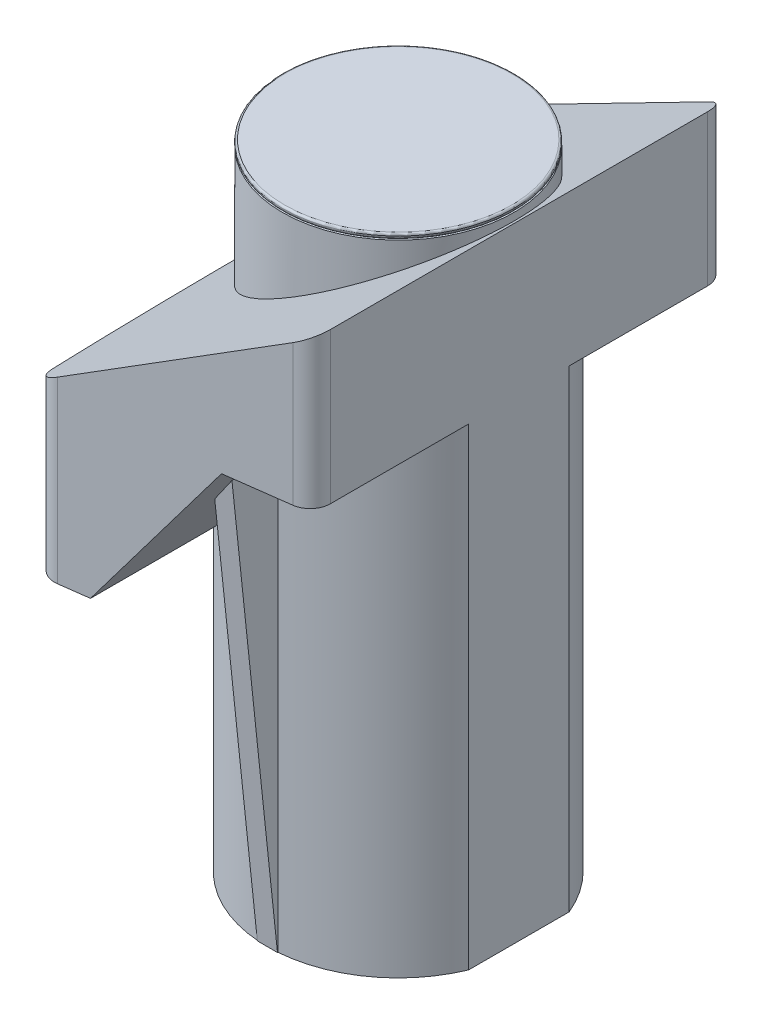
ISO-10303-21;
HEADER;
FILE_DESCRIPTION(('STEP AP214'),'2;1');
FILE_NAME('part.step','',(''),(''),'','','');
FILE_SCHEMA(('AUTOMOTIVE_DESIGN { 1 0 10303 214 1 1 1 1 }'));
ENDSEC;
DATA;
#1=APPLICATION_CONTEXT('core data for automotive mechanical design processes');
#2=APPLICATION_PROTOCOL_DEFINITION('international standard','automotive_design',2000,#1);
#3=PRODUCT_CONTEXT('',#1,'mechanical');
#4=PRODUCT('Part','Part','',(#3));
#5=PRODUCT_RELATED_PRODUCT_CATEGORY('part','',(#4));
#6=PRODUCT_DEFINITION_FORMATION('','',#4);
#7=PRODUCT_DEFINITION_CONTEXT('part definition',#1,'design');
#8=PRODUCT_DEFINITION('design','',#6,#7);
#9=PRODUCT_DEFINITION_SHAPE('','',#8);
#10=(LENGTH_UNIT() NAMED_UNIT(*) SI_UNIT(.MILLI.,.METRE.));
#11=(NAMED_UNIT(*) PLANE_ANGLE_UNIT() SI_UNIT($,.RADIAN.));
#12=(NAMED_UNIT(*) SI_UNIT($,.STERADIAN.) SOLID_ANGLE_UNIT());
#13=UNCERTAINTY_MEASURE_WITH_UNIT(LENGTH_MEASURE(1.E-05),#10,'distance_accuracy_value','');
#14=(GEOMETRIC_REPRESENTATION_CONTEXT(3) GLOBAL_UNCERTAINTY_ASSIGNED_CONTEXT((#13)) GLOBAL_UNIT_ASSIGNED_CONTEXT((#10,
#11,#12)) REPRESENTATION_CONTEXT('',''));
#15=CARTESIAN_POINT('',(0.,0.,0.));
#16=DIRECTION('',(0.,0.,1.));
#17=DIRECTION('',(1.,0.,0.));
#18=AXIS2_PLACEMENT_3D('',#15,#16,#17);
#19=CARTESIAN_POINT('',(0.,63.002,0.));
#20=DIRECTION('',(0.,-1.,0.));
#21=DIRECTION('',(0.,0.,-1.));
#22=AXIS2_PLACEMENT_3D('',#19,#20,#21);
#23=CYLINDRICAL_SURFACE('',#22,13.);
#24=CARTESIAN_POINT('',(0.,41.5313280471877,0.));
#25=DIRECTION('',(0.807133516819442,-0.590368940601281,0.));
#26=DIRECTION('',(-0.590368940601281,-0.807133516819442,0.));
#27=AXIS2_PLACEMENT_3D('',#24,#25,#26);
#28=ELLIPSE('',#27,22.0201286110338,13.);
#29=CARTESIAN_POINT('',(1.,42.8984960353907,12.9614813968157));
#30=VERTEX_POINT('',#29);
#31=CARTESIAN_POINT('',(3.99999999999999,47.,12.369316876853));
#32=VERTEX_POINT('',#31);
#33=EDGE_CURVE('E450',#30,#32,#28,.F.);
#34=ORIENTED_EDGE('',*,*,#33,.F.);
#35=DIRECTION('',(0.,-1.,0.));
#36=VECTOR('',#35,1.);
#37=CARTESIAN_POINT('',(1.,63.002,12.9614813968157));
#38=LINE('',#37,#36);
#39=CARTESIAN_POINT('',(1.,0.,12.9614813968157));
#40=VERTEX_POINT('',#39);
#41=EDGE_CURVE('E244',#30,#40,#38,.T.);
#42=ORIENTED_EDGE('',*,*,#41,.T.);
#43=CARTESIAN_POINT('',(0.,0.,0.));
#44=DIRECTION('',(0.,-1.,0.));
#45=DIRECTION('',(0.,0.,-1.));
#46=AXIS2_PLACEMENT_3D('',#43,#44,#45);
#47=CIRCLE('',#46,13.);
#48=CARTESIAN_POINT('',(12.,0.,5.00000000000002));
#49=VERTEX_POINT('',#48);
#50=EDGE_CURVE('E228',#49,#40,#47,.T.);
#51=ORIENTED_EDGE('',*,*,#50,.F.);
#52=DIRECTION('',(0.,-1.,0.));
#53=VECTOR('',#52,1.);
#54=CARTESIAN_POINT('',(12.,63.002,5.00000000000002));
#55=LINE('',#54,#53);
#56=CARTESIAN_POINT('',(12.,47.,5.00000000000002));
#57=VERTEX_POINT('',#56);
#58=EDGE_CURVE('E446',#57,#49,#55,.T.);
#59=ORIENTED_EDGE('',*,*,#58,.F.);
#60=CARTESIAN_POINT('',(0.,47.,0.));
#61=DIRECTION('',(0.,-1.,0.));
#62=DIRECTION('',(0.,0.,-1.));
#63=AXIS2_PLACEMENT_3D('',#60,#61,#62);
#64=CIRCLE('',#63,13.);
#65=EDGE_CURVE('E453',#32,#57,#64,.F.);
#66=ORIENTED_EDGE('',*,*,#65,.F.);
#67=EDGE_LOOP('',(#34,#42,#51,#59,#66));
#68=FACE_BOUND('',#67,.T.);
#69=ADVANCED_FACE('F36',(#68),#23,.T.);
#70=CARTESIAN_POINT('',(-7.50000000000001,31.2775681356645,-23.75));
#71=DIRECTION('',(0.807133516819442,-0.590368940601281,0.));
#72=DIRECTION('',(0.590368940601281,0.807133516819442,0.));
#73=AXIS2_PLACEMENT_3D('',#70,#71,#72);
#74=PLANE('',#73);
#75=DIRECTION('',(-0.588241093230889,-0.80422439201086,-0.0848265496722035));
#76=VECTOR('',#75,1.);
#77=CARTESIAN_POINT('',(-9.49838549757744,28.5454394552873,16.0108650793523));
#78=LINE('',#77,#76);
#79=CARTESIAN_POINT('',(1.,42.8984960353907,17.5247712466296));
#80=VERTEX_POINT('',#79);
#81=CARTESIAN_POINT('',(-1.,40.1641600589846,17.2363638210065));
#82=VERTEX_POINT('',#81);
#83=EDGE_CURVE('E55',#80,#82,#78,.T.);
#84=ORIENTED_EDGE('',*,*,#83,.F.);
#85=DIRECTION('',(0.,0.,-1.));
#86=VECTOR('',#85,1.);
#87=CARTESIAN_POINT('',(1.,42.8984960353907,-23.75));
#88=LINE('',#87,#86);
#89=EDGE_CURVE('E233',#80,#30,#88,.T.);
#90=ORIENTED_EDGE('',*,*,#89,.T.);
#91=ORIENTED_EDGE('',*,*,#33,.T.);
#92=DIRECTION('',(0.,0.,1.));
#93=VECTOR('',#92,1.);
#94=CARTESIAN_POINT('',(3.99999999999999,47.,-23.75));
#95=LINE('',#94,#93);
#96=CARTESIAN_POINT('',(3.99999999999999,47.,21.5612244897959));
#97=VERTEX_POINT('',#96);
#98=EDGE_CURVE('E514',#32,#97,#95,.T.);
#99=ORIENTED_EDGE('',*,*,#98,.T.);
#100=DIRECTION('',(0.588566823661349,0.804669720228169,-0.0780751908938524));
#101=VECTOR('',#100,1.);
#102=CARTESIAN_POINT('',(-5.34773648938603,34.2200739095535,22.8012303506328));
#103=LINE('',#102,#101);
#104=CARTESIAN_POINT('',(-7.50000000000001,31.2775681356645,23.0867346938775));
#105=VERTEX_POINT('',#104);
#106=EDGE_CURVE('E455',#105,#97,#103,.T.);
#107=ORIENTED_EDGE('',*,*,#106,.F.);
#108=DIRECTION('',(0.,0.,1.));
#109=VECTOR('',#108,1.);
#110=CARTESIAN_POINT('',(-7.50000000000001,31.2775681356645,-23.75));
#111=LINE('',#110,#109);
#112=CARTESIAN_POINT('',(-7.50000000000001,31.2775681356645,10.6183802907976));
#113=VERTEX_POINT('',#112);
#114=EDGE_CURVE('E521',#113,#105,#111,.T.);
#115=ORIENTED_EDGE('',*,*,#114,.F.);
#116=CARTESIAN_POINT('',(-1.,40.1641600589846,12.9614813968157));
#117=VERTEX_POINT('',#116);
#118=EDGE_CURVE('E425',#113,#117,#28,.F.);
#119=ORIENTED_EDGE('',*,*,#118,.T.);
#120=DIRECTION('',(0.,0.,-1.));
#121=VECTOR('',#120,1.);
#122=CARTESIAN_POINT('',(-1.,40.1641600589846,-23.75));
#123=LINE('',#122,#121);
#124=EDGE_CURVE('E60',#82,#117,#123,.T.);
#125=ORIENTED_EDGE('',*,*,#124,.F.);
#126=EDGE_LOOP('',(#84,#90,#91,#99,#107,#115,#119,#125));
#127=FACE_BOUND('',#126,.T.);
#128=ADVANCED_FACE('F353',(#127),#74,.T.);
#129=CARTESIAN_POINT('',(0.,41.5313280471877,0.));
#130=DIRECTION('',(0.807133516819442,-0.590368940601281,0.));
#131=DIRECTION('',(-0.590368940601281,-0.807133516819442,0.));
#132=AXIS2_PLACEMENT_3D('',#129,#130,#131);
#133=ELLIPSE('',#132,22.0201286110338,13.);
#134=CARTESIAN_POINT('',(3.99999999999999,47.,-12.369316876853));
#135=VERTEX_POINT('',#134);
#136=CARTESIAN_POINT('',(1.,42.8984960353907,-12.9614813968157));
#137=VERTEX_POINT('',#136);
#138=EDGE_CURVE('E438',#135,#137,#133,.F.);
#139=ORIENTED_EDGE('',*,*,#138,.T.);
#140=DIRECTION('',(0.,0.,-1.));
#141=VECTOR('',#140,1.);
#142=CARTESIAN_POINT('',(1.,42.8984960353907,-23.75));
#143=LINE('',#142,#141);
#144=CARTESIAN_POINT('',(1.,42.8984960353907,-17.5247712466296));
#145=VERTEX_POINT('',#144);
#146=EDGE_CURVE('E268',#137,#145,#143,.T.);
#147=ORIENTED_EDGE('',*,*,#146,.T.);
#148=DIRECTION('',(-0.588241093230889,-0.80422439201086,0.0848265496722035));
#149=VECTOR('',#148,1.);
#150=CARTESIAN_POINT('',(-7.12820853765382,31.7858695212714,-16.3526533969936));
#151=LINE('',#150,#149);
#152=CARTESIAN_POINT('',(-1.,40.1641600589846,-17.2363638210065));
#153=VERTEX_POINT('',#152);
#154=EDGE_CURVE('E270',#145,#153,#151,.T.);
#155=ORIENTED_EDGE('',*,*,#154,.T.);
#156=DIRECTION('',(0.,0.,-1.));
#157=VECTOR('',#156,1.);
#158=CARTESIAN_POINT('',(-1.,40.1641600589846,-23.75));
#159=LINE('',#158,#157);
#160=CARTESIAN_POINT('',(-1.,40.1641600589846,-12.9614813968157));
#161=VERTEX_POINT('',#160);
#162=EDGE_CURVE('E263',#161,#153,#159,.T.);
#163=ORIENTED_EDGE('',*,*,#162,.F.);
#164=CARTESIAN_POINT('',(-7.50000000000001,31.2775681356645,-10.6183802907976));
#165=VERTEX_POINT('',#164);
#166=EDGE_CURVE('E443',#161,#165,#133,.F.);
#167=ORIENTED_EDGE('',*,*,#166,.T.);
#168=CARTESIAN_POINT('',(-7.50000000000001,31.2775681356645,-23.0867346938775));
#169=VERTEX_POINT('',#168);
#170=EDGE_CURVE('E517',#169,#165,#111,.T.);
#171=ORIENTED_EDGE('',*,*,#170,.F.);
#172=DIRECTION('',(-0.588566823661349,-0.804669720228169,-0.0780751908938524));
#173=VECTOR('',#172,1.);
#174=CARTESIAN_POINT('',(-7.53047867716556,31.235898663921,-23.0907777837056));
#175=LINE('',#174,#173);
#176=CARTESIAN_POINT('',(3.99999999999999,47.,-21.5612244897959));
#177=VERTEX_POINT('',#176);
#178=EDGE_CURVE('E467',#177,#169,#175,.T.);
#179=ORIENTED_EDGE('',*,*,#178,.F.);
#180=EDGE_CURVE('E516',#177,#135,#95,.T.);
#181=ORIENTED_EDGE('',*,*,#180,.T.);
#182=EDGE_LOOP('',(#139,#147,#155,#163,#167,#171,#179,#181));
#183=FACE_BOUND('',#182,.T.);
#184=ADVANCED_FACE('F356',(#183),#74,.T.);
#185=CARTESIAN_POINT('',(1.,0.,-12.9614813968157));
#186=VERTEX_POINT('',#185);
#187=CARTESIAN_POINT('',(12.,0.,-5.00000000000002));
#188=VERTEX_POINT('',#187);
#189=EDGE_CURVE('E279',#186,#188,#47,.T.);
#190=ORIENTED_EDGE('',*,*,#189,.F.);
#191=DIRECTION('',(0.,-1.,0.));
#192=VECTOR('',#191,1.);
#193=CARTESIAN_POINT('',(1.,63.002,-12.9614813968157));
#194=LINE('',#193,#192);
#195=EDGE_CURVE('E266',#186,#137,#194,.F.);
#196=ORIENTED_EDGE('',*,*,#195,.T.);
#197=ORIENTED_EDGE('',*,*,#138,.F.);
#198=CARTESIAN_POINT('',(12.,47.,-5.00000000000002));
#199=VERTEX_POINT('',#198);
#200=EDGE_CURVE('E451',#199,#135,#64,.F.);
#201=ORIENTED_EDGE('',*,*,#200,.F.);
#202=DIRECTION('',(0.,-1.,0.));
#203=VECTOR('',#202,1.);
#204=CARTESIAN_POINT('',(12.,63.002,-5.00000000000002));
#205=LINE('',#204,#203);
#206=EDGE_CURVE('E501',#199,#188,#205,.T.);
#207=ORIENTED_EDGE('',*,*,#206,.T.);
#208=EDGE_LOOP('',(#190,#196,#197,#201,#207));
#209=FACE_BOUND('',#208,.T.);
#210=ADVANCED_FACE('F404',(#209),#23,.T.);
#211=CARTESIAN_POINT('',(-13.5,31.2775681356645,-23.75));
#212=DIRECTION('',(0.,-1.,0.));
#213=DIRECTION('',(1.,0.,0.));
#214=AXIS2_PLACEMENT_3D('',#211,#212,#213);
#215=PLANE('',#214);
#216=DIRECTION('',(1.,0.,0.));
#217=VECTOR('',#216,1.);
#218=CARTESIAN_POINT('',(-12.5009954668574,31.2775681356645,0.75));
#219=LINE('',#218,#217);
#220=CARTESIAN_POINT('',(-13.4990045331427,31.2775681356645,0.75));
#221=VERTEX_POINT('',#220);
#222=CARTESIAN_POINT('',(-12.9783473524174,31.2775681356645,0.75));
#223=VERTEX_POINT('',#222);
#224=EDGE_CURVE('E272',#221,#223,#219,.T.);
#225=ORIENTED_EDGE('',*,*,#224,.T.);
#226=CARTESIAN_POINT('',(0.,31.2775681356645,0.));
#227=DIRECTION('',(0.,-1.,0.));
#228=DIRECTION('',(1.,0.,0.));
#229=AXIS2_PLACEMENT_3D('',#226,#227,#228);
#230=CIRCLE('',#229,13.);
#231=EDGE_CURVE('E434',#223,#113,#230,.F.);
#232=ORIENTED_EDGE('',*,*,#231,.T.);
#233=ORIENTED_EDGE('',*,*,#114,.T.);
#234=DIRECTION('',(0.991316023943281,0.,-0.131501105216966));
#235=VECTOR('',#234,1.);
#236=CARTESIAN_POINT('',(-7.29064770285481,31.2775681356645,23.0589634707869));
#237=LINE('',#236,#235);
#238=CARTESIAN_POINT('',(-10.4126333388468,31.2775681356645,23.4731044225001));
#239=VERTEX_POINT('',#238);
#240=EDGE_CURVE('E441',#239,#105,#237,.T.);
#241=ORIENTED_EDGE('',*,*,#240,.F.);
#242=CARTESIAN_POINT('',(-10.6756355492807,31.2775681356645,21.4904723746135));
#243=DIRECTION('',(0.,-1.,0.));
#244=DIRECTION('',(1.,0.,0.));
#245=AXIS2_PLACEMENT_3D('',#242,#243,#244);
#246=CIRCLE('',#245,2.);
#247=CARTESIAN_POINT('',(-12.6697583826498,31.2775681356645,21.6436850550162));
#248=VERTEX_POINT('',#247);
#249=EDGE_CURVE('E11',#239,#248,#246,.T.);
#250=ORIENTED_EDGE('',*,*,#249,.T.);
#251=CARTESIAN_POINT('',(269.031250000059,31.2775681356642,0.));
#252=DIRECTION('',(0.,-1.,0.));
#253=DIRECTION('',(1.,0.,0.));
#254=AXIS2_PLACEMENT_3D('',#251,#252,#253);
#255=CIRCLE('',#254,282.531250000059);
#256=EDGE_CURVE('E474',#221,#248,#255,.F.);
#257=ORIENTED_EDGE('',*,*,#256,.F.);
#258=EDGE_LOOP('',(#225,#232,#233,#241,#250,#257));
#259=FACE_BOUND('',#258,.T.);
#260=ADVANCED_FACE('F360',(#259),#215,.T.);
#261=DIRECTION('',(0.,-1.,0.));
#262=VECTOR('',#261,1.);
#263=CARTESIAN_POINT('',(-1.,63.002,12.9614813968157));
#264=LINE('',#263,#262);
#265=CARTESIAN_POINT('',(-1.,0.,12.9614813968157));
#266=VERTEX_POINT('',#265);
#267=EDGE_CURVE('E240',#117,#266,#264,.T.);
#268=ORIENTED_EDGE('',*,*,#267,.F.);
#269=ORIENTED_EDGE('',*,*,#118,.F.);
#270=ORIENTED_EDGE('',*,*,#231,.F.);
#271=DIRECTION('',(0.,-1.,0.));
#272=VECTOR('',#271,1.);
#273=CARTESIAN_POINT('',(-12.9783473524174,63.002,0.75));
#274=LINE('',#273,#272);
#275=CARTESIAN_POINT('',(-12.9783473524174,0.,0.75));
#276=VERTEX_POINT('',#275);
#277=EDGE_CURVE('E288',#223,#276,#274,.T.);
#278=ORIENTED_EDGE('',*,*,#277,.T.);
#279=EDGE_CURVE('E426',#266,#276,#47,.T.);
#280=ORIENTED_EDGE('',*,*,#279,.F.);
#281=EDGE_LOOP('',(#268,#269,#270,#278,#280));
#282=FACE_BOUND('',#281,.T.);
#283=ADVANCED_FACE('F326',(#282),#23,.T.);
#284=CARTESIAN_POINT('',(3.99999999999999,47.,-23.75));
#285=DIRECTION('',(0.,-1.,0.));
#286=DIRECTION('',(0.,0.,-1.));
#287=AXIS2_PLACEMENT_3D('',#284,#285,#286);
#288=PLANE('',#287);
#289=DIRECTION('',(-0.991316023943281,0.,-0.131501105216966));
#290=VECTOR('',#289,1.);
#291=CARTESIAN_POINT('',(3.71467307889081,47.,-21.5990739793308));
#292=LINE('',#291,#290);
#293=CARTESIAN_POINT('',(10.2630022104339,47.,-20.7304180741261));
#294=VERTEX_POINT('',#293);
#295=EDGE_CURVE('E469',#294,#177,#292,.T.);
#296=ORIENTED_EDGE('',*,*,#295,.F.);
#297=CARTESIAN_POINT('',(9.99999999999999,47.,-18.7477860262395));
#298=DIRECTION('',(0.,-1.,0.));
#299=DIRECTION('',(0.,0.,-1.));
#300=AXIS2_PLACEMENT_3D('',#297,#298,#299);
#301=CIRCLE('',#300,2.);
#302=CARTESIAN_POINT('',(12.,47.,-18.7477860262395));
#303=VERTEX_POINT('',#302);
#304=EDGE_CURVE('E567',#294,#303,#301,.T.);
#305=ORIENTED_EDGE('',*,*,#304,.T.);
#306=DIRECTION('',(0.,0.,1.));
#307=VECTOR('',#306,1.);
#308=CARTESIAN_POINT('',(12.,47.,-23.75));
#309=LINE('',#308,#307);
#310=EDGE_CURVE('E524',#303,#199,#309,.T.);
#311=ORIENTED_EDGE('',*,*,#310,.T.);
#312=ORIENTED_EDGE('',*,*,#200,.T.);
#313=ORIENTED_EDGE('',*,*,#180,.F.);
#314=EDGE_LOOP('',(#296,#305,#311,#312,#313));
#315=FACE_BOUND('',#314,.T.);
#316=ADVANCED_FACE('F352',(#315),#288,.T.);
#317=CARTESIAN_POINT('',(0.,63.,0.));
#318=DIRECTION('',(0.,-1.,0.));
#319=DIRECTION('',(0.,0.,-1.));
#320=AXIS2_PLACEMENT_3D('',#317,#318,#319);
#321=CYLINDRICAL_SURFACE('',#320,11.5);
#322=CARTESIAN_POINT('',(0.,55.0717967697245,0.));
#323=DIRECTION('',(-0.500000000000001,0.866025403784438,0.));
#324=DIRECTION('',(-0.866025403784438,-0.500000000000001,0.));
#325=AXIS2_PLACEMENT_3D('',#322,#323,#324);
#326=ELLIPSE('',#325,13.2790561913614,11.5);
#327=CARTESIAN_POINT('',(-11.5,48.4322686740438,0.));
#328=VERTEX_POINT('',#327);
#329=EDGE_CURVE('E530',#328,#328,#326,.T.);
#330=ORIENTED_EDGE('',*,*,#329,.T.);
#331=EDGE_LOOP('',(#330));
#332=FACE_BOUND('',#331,.T.);
#333=CARTESIAN_POINT('',(0.,62.45,0.));
#334=DIRECTION('',(0.,1.,0.));
#335=DIRECTION('',(0.,0.,1.));
#336=AXIS2_PLACEMENT_3D('',#333,#334,#335);
#337=CIRCLE('',#336,11.5);
#338=CARTESIAN_POINT('',(0.,62.45,11.5));
#339=VERTEX_POINT('',#338);
#340=EDGE_CURVE('E533',#339,#339,#337,.T.);
#341=ORIENTED_EDGE('',*,*,#340,.F.);
#342=EDGE_LOOP('',(#341));
#343=FACE_BOUND('',#342,.T.);
#344=ADVANCED_FACE('F380',(#332,#343),#321,.T.);
#345=CARTESIAN_POINT('',(0.,62.7,0.));
#346=DIRECTION('',(0.,-1.,0.));
#347=DIRECTION('',(0.,0.,-1.));
#348=AXIS2_PLACEMENT_3D('',#345,#346,#347);
#349=CIRCLE('',#348,11.5);
#350=CARTESIAN_POINT('',(0.,62.7,-11.5));
#351=VERTEX_POINT('',#350);
#352=EDGE_CURVE('E542',#351,#351,#349,.F.);
#353=ORIENTED_EDGE('',*,*,#352,.T.);
#354=EDGE_LOOP('',(#353));
#355=FACE_BOUND('',#354,.T.);
#356=CARTESIAN_POINT('',(0.,62.8,0.));
#357=DIRECTION('',(0.,1.,0.));
#358=DIRECTION('',(0.,0.,1.));
#359=AXIS2_PLACEMENT_3D('',#356,#357,#358);
#360=CIRCLE('',#359,11.5);
#361=CARTESIAN_POINT('',(0.,62.8,11.5));
#362=VERTEX_POINT('',#361);
#363=EDGE_CURVE('E539',#362,#362,#360,.F.);
#364=ORIENTED_EDGE('',*,*,#363,.T.);
#365=EDGE_LOOP('',(#364));
#366=FACE_BOUND('',#365,.T.);
#367=ADVANCED_FACE('F373',(#355,#366),#321,.T.);
#368=CARTESIAN_POINT('',(0.,63.,0.));
#369=DIRECTION('',(0.,1.,0.));
#370=DIRECTION('',(0.,0.,1.));
#371=AXIS2_PLACEMENT_3D('',#368,#369,#370);
#372=PLANE('',#371);
#373=CARTESIAN_POINT('',(0.,63.,0.));
#374=DIRECTION('',(0.,1.,0.));
#375=DIRECTION('',(0.,0.,1.));
#376=AXIS2_PLACEMENT_3D('',#373,#374,#375);
#377=CIRCLE('',#376,11.3);
#378=CARTESIAN_POINT('',(0.,63.,11.3));
#379=VERTEX_POINT('',#378);
#380=EDGE_CURVE('E536',#379,#379,#377,.T.);
#381=ORIENTED_EDGE('',*,*,#380,.T.);
#382=EDGE_LOOP('',(#381));
#383=FACE_BOUND('',#382,.T.);
#384=ADVANCED_FACE('F365',(#383),#372,.T.);
#385=CARTESIAN_POINT('',(-11.7,62.45,0.));
#386=DIRECTION('',(0.,1.,0.));
#387=DIRECTION('',(0.,0.,1.));
#388=AXIS2_PLACEMENT_3D('',#385,#386,#387);
#389=PLANE('',#388);
#390=CARTESIAN_POINT('',(0.,62.45,0.));
#391=DIRECTION('',(0.,-1.,0.));
#392=DIRECTION('',(0.,0.,-1.));
#393=AXIS2_PLACEMENT_3D('',#390,#391,#392);
#394=CIRCLE('',#393,11.3);
#395=CARTESIAN_POINT('',(0.,62.45,-11.3));
#396=VERTEX_POINT('',#395);
#397=EDGE_CURVE('E526',#396,#396,#394,.T.);
#398=ORIENTED_EDGE('',*,*,#397,.T.);
#399=EDGE_LOOP('',(#398));
#400=FACE_BOUND('',#399,.T.);
#401=ORIENTED_EDGE('',*,*,#340,.T.);
#402=EDGE_LOOP('',(#401));
#403=FACE_BOUND('',#402,.T.);
#404=ADVANCED_FACE('F361',(#400,#403),#389,.T.);
#405=CARTESIAN_POINT('',(0.,-22.4131814697477,0.));
#406=DIRECTION('',(0.,-1.,0.));
#407=DIRECTION('',(0.,0.,-1.));
#408=AXIS2_PLACEMENT_3D('',#405,#406,#407);
#409=CYLINDRICAL_SURFACE('',#408,11.3);
#410=CARTESIAN_POINT('',(0.,62.5,0.));
#411=DIRECTION('',(0.,-1.,0.));
#412=DIRECTION('',(0.,0.,-1.));
#413=AXIS2_PLACEMENT_3D('',#410,#411,#412);
#414=CIRCLE('',#413,11.3);
#415=CARTESIAN_POINT('',(0.,62.5,-11.3));
#416=VERTEX_POINT('',#415);
#417=EDGE_CURVE('E529',#416,#416,#414,.T.);
#418=ORIENTED_EDGE('',*,*,#417,.T.);
#419=EDGE_LOOP('',(#418));
#420=FACE_BOUND('',#419,.T.);
#421=ORIENTED_EDGE('',*,*,#397,.F.);
#422=EDGE_LOOP('',(#421));
#423=FACE_BOUND('',#422,.T.);
#424=ADVANCED_FACE('F364',(#420,#423),#409,.T.);
#425=CARTESIAN_POINT('',(0.,62.8,0.));
#426=DIRECTION('',(0.,1.,0.));
#427=DIRECTION('',(0.,0.,1.));
#428=AXIS2_PLACEMENT_3D('',#425,#426,#427);
#429=TOROIDAL_SURFACE('',#428,11.3,0.2);
#430=ORIENTED_EDGE('',*,*,#363,.F.);
#431=EDGE_LOOP('',(#430));
#432=FACE_BOUND('',#431,.T.);
#433=ORIENTED_EDGE('',*,*,#380,.F.);
#434=EDGE_LOOP('',(#433));
#435=FACE_BOUND('',#434,.T.);
#436=ADVANCED_FACE('F369',(#432,#435),#429,.T.);
#437=CARTESIAN_POINT('',(0.,62.7,0.));
#438=DIRECTION('',(0.,-1.,0.));
#439=DIRECTION('',(0.,0.,-1.));
#440=AXIS2_PLACEMENT_3D('',#437,#438,#439);
#441=TOROIDAL_SURFACE('',#440,11.3,0.2);
#442=ORIENTED_EDGE('',*,*,#352,.F.);
#443=EDGE_LOOP('',(#442));
#444=FACE_BOUND('',#443,.T.);
#445=ORIENTED_EDGE('',*,*,#417,.F.);
#446=EDGE_LOOP('',(#445));
#447=FACE_BOUND('',#446,.T.);
#448=ADVANCED_FACE('F343',(#444,#447),#441,.T.);
#449=CARTESIAN_POINT('',(-13.5,47.2775681356645,-23.75));
#450=DIRECTION('',(-0.500000000000001,0.866025403784438,0.));
#451=DIRECTION('',(-0.866025403784438,-0.500000000000001,0.));
#452=AXIS2_PLACEMENT_3D('',#449,#450,#451);
#453=PLANE('',#452);
#454=CARTESIAN_POINT('',(9.99999999999999,60.8452994616208,18.7477860262395));
#455=DIRECTION('',(-0.500000000000001,0.866025403784438,0.));
#456=DIRECTION('',(-0.866025403784438,-0.500000000000001,0.));
#457=AXIS2_PLACEMENT_3D('',#454,#455,#456);
#458=ELLIPSE('',#457,2.3094010767585,2.);
#459=CARTESIAN_POINT('',(10.2630022104339,60.9971438586122,20.7304180741261));
#460=VERTEX_POINT('',#459);
#461=CARTESIAN_POINT('',(12.,62.,18.7477860262395));
#462=VERTEX_POINT('',#461);
#463=EDGE_CURVE('E557',#460,#462,#458,.T.);
#464=ORIENTED_EDGE('',*,*,#463,.T.);
#465=DIRECTION('',(0.,0.,1.));
#466=VECTOR('',#465,1.);
#467=CARTESIAN_POINT('',(12.,62.,-23.75));
#468=LINE('',#467,#466);
#469=CARTESIAN_POINT('',(12.,62.,-18.7477860262395));
#470=VERTEX_POINT('',#469);
#471=EDGE_CURVE('E548',#470,#462,#468,.T.);
#472=ORIENTED_EDGE('',*,*,#471,.F.);
#473=CARTESIAN_POINT('',(9.99999999999999,60.8452994616207,-18.7477860262395));
#474=DIRECTION('',(-0.500000000000001,0.866025403784438,0.));
#475=DIRECTION('',(-0.866025403784438,-0.500000000000001,0.));
#476=AXIS2_PLACEMENT_3D('',#473,#474,#475);
#477=ELLIPSE('',#476,2.3094010767585,2.);
#478=CARTESIAN_POINT('',(10.2630022104339,60.9971438586122,-20.7304180741261));
#479=VERTEX_POINT('',#478);
#480=EDGE_CURVE('E560',#470,#479,#477,.T.);
#481=ORIENTED_EDGE('',*,*,#480,.T.);
#482=DIRECTION('',(0.860366614832539,0.496732896675335,0.114130265232888));
#483=VECTOR('',#482,1.);
#484=CARTESIAN_POINT('',(-13.4869742825579,47.2850885371361,-23.8809251599311));
#485=LINE('',#484,#483);
#486=CARTESIAN_POINT('',(-10.4126333388468,49.0600601085684,-23.4731044225001));
#487=VERTEX_POINT('',#486);
#488=EDGE_CURVE('E471',#487,#479,#485,.T.);
#489=ORIENTED_EDGE('',*,*,#488,.F.);
#490=CARTESIAN_POINT('',(-10.6756355492807,48.9082157115769,-21.4904723746135));
#491=DIRECTION('',(-0.500000000000001,0.866025403784438,0.));
#492=DIRECTION('',(0.866025403784438,0.500000000000001,0.));
#493=AXIS2_PLACEMENT_3D('',#490,#491,#492);
#494=ELLIPSE('',#493,2.3094010767585,2.);
#495=CARTESIAN_POINT('',(-12.6697583826498,47.7569083569341,-21.6436850550163));
#496=VERTEX_POINT('',#495);
#497=EDGE_CURVE('E553',#487,#496,#494,.T.);
#498=ORIENTED_EDGE('',*,*,#497,.T.);
#499=CARTESIAN_POINT('',(269.031250000059,210.397061377681,0.));
#500=DIRECTION('',(-0.500000000000001,0.866025403784438,0.));
#501=DIRECTION('',(0.866025403784438,0.500000000000001,0.));
#502=AXIS2_PLACEMENT_3D('',#499,#500,#501);
#503=ELLIPSE('',#502,326.238986484031,282.531250000059);
#504=CARTESIAN_POINT('',(-12.6697583826498,47.7569083569341,21.6436850550162));
#505=VERTEX_POINT('',#504);
#506=EDGE_CURVE('E477',#505,#496,#503,.F.);
#507=ORIENTED_EDGE('',*,*,#506,.F.);
#508=CARTESIAN_POINT('',(-10.6756355492807,48.9082157115769,21.4904723746135));
#509=DIRECTION('',(-0.500000000000001,0.866025403784438,0.));
#510=DIRECTION('',(0.866025403784438,0.500000000000001,0.));
#511=AXIS2_PLACEMENT_3D('',#508,#509,#510);
#512=ELLIPSE('',#511,2.3094010767585,2.);
#513=CARTESIAN_POINT('',(-10.4126333388468,49.0600601085684,23.4731044225001));
#514=VERTEX_POINT('',#513);
#515=EDGE_CURVE('E555',#505,#514,#512,.T.);
#516=ORIENTED_EDGE('',*,*,#515,.T.);
#517=DIRECTION('',(-0.860366614832539,-0.496732896675335,0.114130265232888));
#518=VECTOR('',#517,1.);
#519=CARTESIAN_POINT('',(-8.82276546001081,49.9779707563903,23.26220358143));
#520=LINE('',#519,#518);
#521=EDGE_CURVE('E461',#460,#514,#520,.T.);
#522=ORIENTED_EDGE('',*,*,#521,.F.);
#523=EDGE_LOOP('',(#464,#472,#481,#489,#498,#507,#516,#522));
#524=FACE_BOUND('',#523,.T.);
#525=ORIENTED_EDGE('',*,*,#329,.F.);
#526=EDGE_LOOP('',(#525));
#527=FACE_BOUND('',#526,.T.);
#528=ADVANCED_FACE('F339',(#524,#527),#453,.T.);
#529=CARTESIAN_POINT('',(12.,47.,-23.75));
#530=DIRECTION('',(1.,0.,0.));
#531=DIRECTION('',(0.,0.,-1.));
#532=AXIS2_PLACEMENT_3D('',#529,#530,#531);
#533=PLANE('',#532);
#534=ORIENTED_EDGE('',*,*,#471,.T.);
#535=DIRECTION('',(0.,1.,0.));
#536=VECTOR('',#535,1.);
#537=CARTESIAN_POINT('',(12.,47.,18.7477860262395));
#538=LINE('',#537,#536);
#539=CARTESIAN_POINT('',(12.,47.,18.7477860262395));
#540=VERTEX_POINT('',#539);
#541=EDGE_CURVE('E545',#462,#540,#538,.F.);
#542=ORIENTED_EDGE('',*,*,#541,.T.);
#543=EDGE_CURVE('E509',#57,#540,#309,.T.);
#544=ORIENTED_EDGE('',*,*,#543,.F.);
#545=ORIENTED_EDGE('',*,*,#58,.T.);
#546=DIRECTION('',(0.,0.,1.));
#547=VECTOR('',#546,1.);
#548=CARTESIAN_POINT('',(12.,0.,5.00000000000002));
#549=LINE('',#548,#547);
#550=EDGE_CURVE('E500',#188,#49,#549,.T.);
#551=ORIENTED_EDGE('',*,*,#550,.F.);
#552=ORIENTED_EDGE('',*,*,#206,.F.);
#553=ORIENTED_EDGE('',*,*,#310,.F.);
#554=DIRECTION('',(0.,1.,0.));
#555=VECTOR('',#554,1.);
#556=CARTESIAN_POINT('',(12.,62.,-18.7477860262395));
#557=LINE('',#556,#555);
#558=EDGE_CURVE('E550',#303,#470,#557,.T.);
#559=ORIENTED_EDGE('',*,*,#558,.T.);
#560=EDGE_LOOP('',(#534,#542,#544,#545,#551,#552,#553,#559));
#561=FACE_BOUND('',#560,.T.);
#562=ADVANCED_FACE('F342',(#561),#533,.T.);
#563=ORIENTED_EDGE('',*,*,#543,.T.);
#564=CARTESIAN_POINT('',(9.99999999999999,47.,18.7477860262395));
#565=DIRECTION('',(0.,-1.,0.));
#566=DIRECTION('',(0.,0.,-1.));
#567=AXIS2_PLACEMENT_3D('',#564,#565,#566);
#568=CIRCLE('',#567,2.);
#569=CARTESIAN_POINT('',(10.2630022104339,47.,20.7304180741261));
#570=VERTEX_POINT('',#569);
#571=EDGE_CURVE('E574',#540,#570,#568,.T.);
#572=ORIENTED_EDGE('',*,*,#571,.T.);
#573=DIRECTION('',(0.991316023943281,0.,-0.131501105216966));
#574=VECTOR('',#573,1.);
#575=CARTESIAN_POINT('',(9.90673283536272,47.,20.7776782973498));
#576=LINE('',#575,#574);
#577=EDGE_CURVE('E458',#97,#570,#576,.T.);
#578=ORIENTED_EDGE('',*,*,#577,.F.);
#579=ORIENTED_EDGE('',*,*,#98,.F.);
#580=ORIENTED_EDGE('',*,*,#65,.T.);
#581=EDGE_LOOP('',(#563,#572,#578,#579,#580));
#582=FACE_BOUND('',#581,.T.);
#583=ADVANCED_FACE('F347',(#582),#288,.T.);
#584=DIRECTION('',(-1.,0.,0.));
#585=VECTOR('',#584,1.);
#586=CARTESIAN_POINT('',(-12.5009954668574,31.2775681356645,-0.75));
#587=LINE('',#586,#585);
#588=CARTESIAN_POINT('',(-12.9783473524174,31.2775681356645,-0.75));
#589=VERTEX_POINT('',#588);
#590=CARTESIAN_POINT('',(-13.4990045331427,31.2775681356645,-0.75));
#591=VERTEX_POINT('',#590);
#592=EDGE_CURVE('E287',#589,#591,#587,.T.);
#593=ORIENTED_EDGE('',*,*,#592,.T.);
#594=CARTESIAN_POINT('',(-12.6697583826498,31.2775681356645,-21.6436850550162));
#595=VERTEX_POINT('',#594);
#596=EDGE_CURVE('E482',#595,#591,#255,.F.);
#597=ORIENTED_EDGE('',*,*,#596,.F.);
#598=CARTESIAN_POINT('',(-10.6756355492807,31.2775681356645,-21.4904723746135));
#599=DIRECTION('',(0.,-1.,0.));
#600=DIRECTION('',(1.,0.,0.));
#601=AXIS2_PLACEMENT_3D('',#598,#599,#600);
#602=CIRCLE('',#601,2.);
#603=CARTESIAN_POINT('',(-10.4126333388468,31.2775681356645,-23.4731044225001));
#604=VERTEX_POINT('',#603);
#605=EDGE_CURVE('E47',#595,#604,#602,.T.);
#606=ORIENTED_EDGE('',*,*,#605,.T.);
#607=DIRECTION('',(-0.991316023943281,0.,-0.131501105216966));
#608=VECTOR('',#607,1.);
#609=CARTESIAN_POINT('',(-13.4827074593267,31.2775681356645,-23.8803591527678));
#610=LINE('',#609,#608);
#611=EDGE_CURVE('E464',#169,#604,#610,.T.);
#612=ORIENTED_EDGE('',*,*,#611,.F.);
#613=ORIENTED_EDGE('',*,*,#170,.T.);
#614=EDGE_CURVE('E437',#165,#589,#230,.F.);
#615=ORIENTED_EDGE('',*,*,#614,.T.);
#616=EDGE_LOOP('',(#593,#597,#606,#612,#613,#615));
#617=FACE_BOUND('',#616,.T.);
#618=ADVANCED_FACE('F337',(#617),#215,.T.);
#619=CARTESIAN_POINT('',(269.031250000059,15.5,0.));
#620=DIRECTION('',(0.,1.,0.));
#621=DIRECTION('',(0.,0.,1.));
#622=AXIS2_PLACEMENT_3D('',#619,#620,#621);
#623=CYLINDRICAL_SURFACE('',#622,282.531250000059);
#624=ORIENTED_EDGE('',*,*,#596,.T.);
#625=CARTESIAN_POINT('',(269.031250000059,31.2775681356645,0.));
#626=DIRECTION('',(0.,1.,0.));
#627=DIRECTION('',(-0.99999647661327,0.,-0.00265457360907025));
#628=AXIS2_PLACEMENT_3D('',#625,#626,#627);
#629=CIRCLE('',#628,282.531250000059);
#630=EDGE_CURVE('E286',#591,#221,#629,.T.);
#631=ORIENTED_EDGE('',*,*,#630,.T.);
#632=ORIENTED_EDGE('',*,*,#256,.T.);
#633=DIRECTION('',(0.,1.,0.));
#634=VECTOR('',#633,1.);
#635=CARTESIAN_POINT('',(-12.6697583826498,15.5,21.6436850550162));
#636=LINE('',#635,#634);
#637=EDGE_CURVE('E578',#248,#505,#636,.T.);
#638=ORIENTED_EDGE('',*,*,#637,.T.);
#639=ORIENTED_EDGE('',*,*,#506,.T.);
#640=DIRECTION('',(0.,1.,0.));
#641=VECTOR('',#640,1.);
#642=CARTESIAN_POINT('',(-12.6697583826498,15.5,-21.6436850550162));
#643=LINE('',#642,#641);
#644=EDGE_CURVE('E576',#496,#595,#643,.F.);
#645=ORIENTED_EDGE('',*,*,#644,.T.);
#646=EDGE_LOOP('',(#624,#631,#632,#638,#639,#645));
#647=FACE_BOUND('',#646,.T.);
#648=ADVANCED_FACE('F332',(#647),#623,.T.);
#649=CARTESIAN_POINT('',(-12.5,-437.,23.75));
#650=DIRECTION('',(-0.131501105216966,0.,-0.991316023943281));
#651=DIRECTION('',(-0.991316023943281,0.,0.131501105216966));
#652=AXIS2_PLACEMENT_3D('',#649,#650,#651);
#653=PLANE('',#652);
#654=ORIENTED_EDGE('',*,*,#577,.T.);
#655=DIRECTION('',(0.,1.,0.));
#656=VECTOR('',#655,1.);
#657=CARTESIAN_POINT('',(10.2630022104339,62.,20.7304180741261));
#658=LINE('',#657,#656);
#659=EDGE_CURVE('E571',#570,#460,#658,.T.);
#660=ORIENTED_EDGE('',*,*,#659,.T.);
#661=ORIENTED_EDGE('',*,*,#521,.T.);
#662=DIRECTION('',(0.,1.,0.));
#663=VECTOR('',#662,1.);
#664=CARTESIAN_POINT('',(-10.4126333388468,-437.,23.4731044225001));
#665=LINE('',#664,#663);
#666=EDGE_CURVE('E569',#514,#239,#665,.F.);
#667=ORIENTED_EDGE('',*,*,#666,.T.);
#668=ORIENTED_EDGE('',*,*,#240,.T.);
#669=ORIENTED_EDGE('',*,*,#106,.T.);
#670=EDGE_LOOP('',(#654,#660,#661,#667,#668,#669));
#671=FACE_BOUND('',#670,.T.);
#672=ADVANCED_FACE('F329',(#671),#653,.F.);
#673=CARTESIAN_POINT('',(-12.5,-437.,-23.75));
#674=DIRECTION('',(-0.131501105216966,0.,0.991316023943281));
#675=DIRECTION('',(0.991316023943281,0.,0.131501105216966));
#676=AXIS2_PLACEMENT_3D('',#673,#674,#675);
#677=PLANE('',#676);
#678=ORIENTED_EDGE('',*,*,#488,.T.);
#679=DIRECTION('',(0.,1.,0.));
#680=VECTOR('',#679,1.);
#681=CARTESIAN_POINT('',(10.2630022104339,47.,-20.7304180741261));
#682=LINE('',#681,#680);
#683=EDGE_CURVE('E565',#479,#294,#682,.F.);
#684=ORIENTED_EDGE('',*,*,#683,.T.);
#685=ORIENTED_EDGE('',*,*,#295,.T.);
#686=ORIENTED_EDGE('',*,*,#178,.T.);
#687=ORIENTED_EDGE('',*,*,#611,.T.);
#688=DIRECTION('',(0.,1.,0.));
#689=VECTOR('',#688,1.);
#690=CARTESIAN_POINT('',(-10.4126333388468,-437.,-23.4731044225001));
#691=LINE('',#690,#689);
#692=EDGE_CURVE('E562',#604,#487,#691,.T.);
#693=ORIENTED_EDGE('',*,*,#692,.T.);
#694=EDGE_LOOP('',(#678,#684,#685,#686,#687,#693));
#695=FACE_BOUND('',#694,.T.);
#696=ADVANCED_FACE('F324',(#695),#677,.F.);
#697=DIRECTION('',(0.,-1.,0.));
#698=VECTOR('',#697,1.);
#699=CARTESIAN_POINT('',(-1.,63.002,-12.9614813968157));
#700=LINE('',#699,#698);
#701=CARTESIAN_POINT('',(-1.,0.,-12.9614813968157));
#702=VERTEX_POINT('',#701);
#703=EDGE_CURVE('E260',#702,#161,#700,.F.);
#704=ORIENTED_EDGE('',*,*,#703,.F.);
#705=CARTESIAN_POINT('',(-12.9783473524174,0.,-0.75));
#706=VERTEX_POINT('',#705);
#707=EDGE_CURVE('E431',#706,#702,#47,.T.);
#708=ORIENTED_EDGE('',*,*,#707,.F.);
#709=DIRECTION('',(0.,-1.,0.));
#710=VECTOR('',#709,1.);
#711=CARTESIAN_POINT('',(-12.9783473524174,63.002,-0.75));
#712=LINE('',#711,#710);
#713=EDGE_CURVE('E283',#706,#589,#712,.F.);
#714=ORIENTED_EDGE('',*,*,#713,.T.);
#715=ORIENTED_EDGE('',*,*,#614,.F.);
#716=ORIENTED_EDGE('',*,*,#166,.F.);
#717=EDGE_LOOP('',(#704,#708,#714,#715,#716));
#718=FACE_BOUND('',#717,.T.);
#719=ADVANCED_FACE('F321',(#718),#23,.T.);
#720=CARTESIAN_POINT('',(0.,0.,0.));
#721=DIRECTION('',(0.,1.,0.));
#722=DIRECTION('',(0.,0.,1.));
#723=AXIS2_PLACEMENT_3D('',#720,#721,#722);
#724=PLANE('',#723);
#725=ORIENTED_EDGE('',*,*,#50,.T.);
#726=DIRECTION('',(0.,0.,1.));
#727=VECTOR('',#726,1.);
#728=CARTESIAN_POINT('',(1.,0.,13.));
#729=LINE('',#728,#727);
#730=CARTESIAN_POINT('',(1.,0.,13.));
#731=VERTEX_POINT('',#730);
#732=EDGE_CURVE('E224',#40,#731,#729,.T.);
#733=ORIENTED_EDGE('',*,*,#732,.T.);
#734=DIRECTION('',(-1.,0.,0.));
#735=VECTOR('',#734,1.);
#736=CARTESIAN_POINT('',(1.,0.,13.));
#737=LINE('',#736,#735);
#738=CARTESIAN_POINT('',(-1.,0.,13.));
#739=VERTEX_POINT('',#738);
#740=EDGE_CURVE('E211',#731,#739,#737,.T.);
#741=ORIENTED_EDGE('',*,*,#740,.T.);
#742=DIRECTION('',(0.,0.,1.));
#743=VECTOR('',#742,1.);
#744=CARTESIAN_POINT('',(-1.,0.,13.));
#745=LINE('',#744,#743);
#746=EDGE_CURVE('E236',#266,#739,#745,.T.);
#747=ORIENTED_EDGE('',*,*,#746,.F.);
#748=ORIENTED_EDGE('',*,*,#279,.T.);
#749=DIRECTION('',(-1.,0.,0.));
#750=VECTOR('',#749,1.);
#751=CARTESIAN_POINT('',(-12.5009954668574,0.,0.75));
#752=LINE('',#751,#750);
#753=CARTESIAN_POINT('',(-13.4990045331427,0.,0.75));
#754=VERTEX_POINT('',#753);
#755=EDGE_CURVE('E276',#276,#754,#752,.T.);
#756=ORIENTED_EDGE('',*,*,#755,.T.);
#757=DIRECTION('',(0.,0.,-1.));
#758=VECTOR('',#757,1.);
#759=CARTESIAN_POINT('',(-13.4990045331427,0.,0.75));
#760=LINE('',#759,#758);
#761=CARTESIAN_POINT('',(-13.4990045331427,0.,-0.75));
#762=VERTEX_POINT('',#761);
#763=EDGE_CURVE('E275',#754,#762,#760,.T.);
#764=ORIENTED_EDGE('',*,*,#763,.T.);
#765=DIRECTION('',(1.,0.,0.));
#766=VECTOR('',#765,1.);
#767=CARTESIAN_POINT('',(-12.5009954668574,0.,-0.75));
#768=LINE('',#767,#766);
#769=EDGE_CURVE('E273',#762,#706,#768,.T.);
#770=ORIENTED_EDGE('',*,*,#769,.T.);
#771=ORIENTED_EDGE('',*,*,#707,.T.);
#772=DIRECTION('',(0.,0.,-1.));
#773=VECTOR('',#772,1.);
#774=CARTESIAN_POINT('',(-1.,0.,-13.));
#775=LINE('',#774,#773);
#776=CARTESIAN_POINT('',(-1.,0.,-13.));
#777=VERTEX_POINT('',#776);
#778=EDGE_CURVE('E247',#702,#777,#775,.T.);
#779=ORIENTED_EDGE('',*,*,#778,.T.);
#780=DIRECTION('',(-1.,0.,0.));
#781=VECTOR('',#780,1.);
#782=CARTESIAN_POINT('',(1.,0.,-13.));
#783=LINE('',#782,#781);
#784=CARTESIAN_POINT('',(1.,0.,-13.));
#785=VERTEX_POINT('',#784);
#786=EDGE_CURVE('E254',#785,#777,#783,.T.);
#787=ORIENTED_EDGE('',*,*,#786,.F.);
#788=DIRECTION('',(0.,0.,-1.));
#789=VECTOR('',#788,1.);
#790=CARTESIAN_POINT('',(1.,0.,-13.));
#791=LINE('',#790,#789);
#792=EDGE_CURVE('E248',#186,#785,#791,.T.);
#793=ORIENTED_EDGE('',*,*,#792,.F.);
#794=ORIENTED_EDGE('',*,*,#189,.T.);
#795=ORIENTED_EDGE('',*,*,#550,.T.);
#796=EDGE_LOOP('',(#725,#733,#741,#747,#748,#756,#764,#770,#771,#779,#787,#793,#794,#795));
#797=FACE_BOUND('',#796,.T.);
#798=ADVANCED_FACE('F225',(#797),#724,.F.);
#799=CARTESIAN_POINT('',(9.99999999999999,47.,-18.7477860262395));
#800=DIRECTION('',(0.,-1.,0.));
#801=DIRECTION('',(0.,0.,-1.));
#802=AXIS2_PLACEMENT_3D('',#799,#800,#801);
#803=CYLINDRICAL_SURFACE('',#802,2.);
#804=ORIENTED_EDGE('',*,*,#304,.F.);
#805=ORIENTED_EDGE('',*,*,#683,.F.);
#806=ORIENTED_EDGE('',*,*,#480,.F.);
#807=ORIENTED_EDGE('',*,*,#558,.F.);
#808=EDGE_LOOP('',(#804,#805,#806,#807));
#809=FACE_BOUND('',#808,.T.);
#810=ADVANCED_FACE('F377',(#809),#803,.T.);
#811=CARTESIAN_POINT('',(9.99999999999999,-437.,18.7477860262395));
#812=DIRECTION('',(0.,-1.,0.));
#813=DIRECTION('',(0.,0.,-1.));
#814=AXIS2_PLACEMENT_3D('',#811,#812,#813);
#815=CYLINDRICAL_SURFACE('',#814,2.);
#816=ORIENTED_EDGE('',*,*,#571,.F.);
#817=ORIENTED_EDGE('',*,*,#541,.F.);
#818=ORIENTED_EDGE('',*,*,#463,.F.);
#819=ORIENTED_EDGE('',*,*,#659,.F.);
#820=EDGE_LOOP('',(#816,#817,#818,#819));
#821=FACE_BOUND('',#820,.T.);
#822=ADVANCED_FACE('F390',(#821),#815,.T.);
#823=CARTESIAN_POINT('',(-10.6756355492807,15.5,21.4904723746135));
#824=DIRECTION('',(0.,1.,0.));
#825=DIRECTION('',(0.,0.,1.));
#826=AXIS2_PLACEMENT_3D('',#823,#824,#825);
#827=CYLINDRICAL_SURFACE('',#826,2.);
#828=ORIENTED_EDGE('',*,*,#249,.F.);
#829=ORIENTED_EDGE('',*,*,#666,.F.);
#830=ORIENTED_EDGE('',*,*,#515,.F.);
#831=ORIENTED_EDGE('',*,*,#637,.F.);
#832=EDGE_LOOP('',(#828,#829,#830,#831));
#833=FACE_BOUND('',#832,.T.);
#834=ADVANCED_FACE('F393',(#833),#827,.T.);
#835=CARTESIAN_POINT('',(-10.6756355492807,15.5,-21.4904723746135));
#836=DIRECTION('',(0.,1.,0.));
#837=DIRECTION('',(0.,0.,1.));
#838=AXIS2_PLACEMENT_3D('',#835,#836,#837);
#839=CYLINDRICAL_SURFACE('',#838,2.);
#840=ORIENTED_EDGE('',*,*,#605,.F.);
#841=ORIENTED_EDGE('',*,*,#644,.F.);
#842=ORIENTED_EDGE('',*,*,#497,.F.);
#843=ORIENTED_EDGE('',*,*,#692,.F.);
#844=EDGE_LOOP('',(#840,#841,#842,#843));
#845=FACE_BOUND('',#844,.T.);
#846=ADVANCED_FACE('F38',(#845),#839,.T.);
#847=CARTESIAN_POINT('',(-13.4990045331427,63.002,0.75));
#848=DIRECTION('',(-1.,0.,0.));
#849=DIRECTION('',(0.,0.,1.));
#850=AXIS2_PLACEMENT_3D('',#847,#848,#849);
#851=PLANE('',#850);
#852=ORIENTED_EDGE('',*,*,#630,.F.);
#853=DIRECTION('',(0.,-1.,0.));
#854=VECTOR('',#853,1.);
#855=CARTESIAN_POINT('',(-13.4990045331427,63.002,-0.75));
#856=LINE('',#855,#854);
#857=EDGE_CURVE('E487',#591,#762,#856,.T.);
#858=ORIENTED_EDGE('',*,*,#857,.T.);
#859=ORIENTED_EDGE('',*,*,#763,.F.);
#860=DIRECTION('',(0.,-1.,0.));
#861=VECTOR('',#860,1.);
#862=CARTESIAN_POINT('',(-13.4990045331427,63.002,0.75));
#863=LINE('',#862,#861);
#864=EDGE_CURVE('E282',#221,#754,#863,.T.);
#865=ORIENTED_EDGE('',*,*,#864,.F.);
#866=EDGE_LOOP('',(#852,#858,#859,#865));
#867=FACE_BOUND('',#866,.T.);
#868=ADVANCED_FACE('F301',(#867),#851,.T.);
#869=CARTESIAN_POINT('',(-12.5009954668574,63.002,0.75));
#870=DIRECTION('',(0.,0.,1.));
#871=DIRECTION('',(1.,0.,0.));
#872=AXIS2_PLACEMENT_3D('',#869,#870,#871);
#873=PLANE('',#872);
#874=ORIENTED_EDGE('',*,*,#277,.F.);
#875=ORIENTED_EDGE('',*,*,#224,.F.);
#876=ORIENTED_EDGE('',*,*,#864,.T.);
#877=ORIENTED_EDGE('',*,*,#755,.F.);
#878=EDGE_LOOP('',(#874,#875,#876,#877));
#879=FACE_BOUND('',#878,.T.);
#880=ADVANCED_FACE('F311',(#879),#873,.T.);
#881=CARTESIAN_POINT('',(-12.5009954668574,63.002,-0.75));
#882=DIRECTION('',(0.,0.,-1.));
#883=DIRECTION('',(-1.,0.,0.));
#884=AXIS2_PLACEMENT_3D('',#881,#882,#883);
#885=PLANE('',#884);
#886=ORIENTED_EDGE('',*,*,#713,.F.);
#887=ORIENTED_EDGE('',*,*,#769,.F.);
#888=ORIENTED_EDGE('',*,*,#857,.F.);
#889=ORIENTED_EDGE('',*,*,#592,.F.);
#890=EDGE_LOOP('',(#886,#887,#888,#889));
#891=FACE_BOUND('',#890,.T.);
#892=ADVANCED_FACE('F316',(#891),#885,.T.);
#893=CARTESIAN_POINT('',(1.,0.,-13.));
#894=DIRECTION('',(0.,0.104894347811369,0.994483371302521));
#895=DIRECTION('',(0.,-0.994483371302521,0.104894347811369));
#896=AXIS2_PLACEMENT_3D('',#893,#894,#895);
#897=PLANE('',#896);
#898=ORIENTED_EDGE('',*,*,#154,.F.);
#899=DIRECTION('',(0.,0.994483371302521,-0.104894347811369));
#900=VECTOR('',#899,1.);
#901=CARTESIAN_POINT('',(1.,0.,-13.));
#902=LINE('',#901,#900);
#903=EDGE_CURVE('E250',#785,#145,#902,.T.);
#904=ORIENTED_EDGE('',*,*,#903,.F.);
#905=ORIENTED_EDGE('',*,*,#786,.T.);
#906=DIRECTION('',(0.,0.994483371302521,-0.104894347811369));
#907=VECTOR('',#906,1.);
#908=CARTESIAN_POINT('',(-1.,0.,-13.));
#909=LINE('',#908,#907);
#910=EDGE_CURVE('E251',#777,#153,#909,.T.);
#911=ORIENTED_EDGE('',*,*,#910,.T.);
#912=EDGE_LOOP('',(#898,#904,#905,#911));
#913=FACE_BOUND('',#912,.T.);
#914=ADVANCED_FACE('F312',(#913),#897,.F.);
#915=CARTESIAN_POINT('',(1.,0.,0.));
#916=DIRECTION('',(-1.,0.,0.));
#917=DIRECTION('',(0.,0.,1.));
#918=AXIS2_PLACEMENT_3D('',#915,#916,#917);
#919=PLANE('',#918);
#920=ORIENTED_EDGE('',*,*,#146,.F.);
#921=ORIENTED_EDGE('',*,*,#195,.F.);
#922=ORIENTED_EDGE('',*,*,#792,.T.);
#923=ORIENTED_EDGE('',*,*,#903,.T.);
#924=EDGE_LOOP('',(#920,#921,#922,#923));
#925=FACE_BOUND('',#924,.T.);
#926=ADVANCED_FACE('F611',(#925),#919,.F.);
#927=CARTESIAN_POINT('',(-1.,0.,0.));
#928=DIRECTION('',(-1.,0.,0.));
#929=DIRECTION('',(0.,0.,1.));
#930=AXIS2_PLACEMENT_3D('',#927,#928,#929);
#931=PLANE('',#930);
#932=ORIENTED_EDGE('',*,*,#703,.T.);
#933=ORIENTED_EDGE('',*,*,#162,.T.);
#934=ORIENTED_EDGE('',*,*,#910,.F.);
#935=ORIENTED_EDGE('',*,*,#778,.F.);
#936=EDGE_LOOP('',(#932,#933,#934,#935));
#937=FACE_BOUND('',#936,.T.);
#938=ADVANCED_FACE('F603',(#937),#931,.T.);
#939=CARTESIAN_POINT('',(1.,0.,13.));
#940=DIRECTION('',(0.,-0.104894347811369,0.994483371302521));
#941=DIRECTION('',(0.,-0.994483371302521,-0.104894347811369));
#942=AXIS2_PLACEMENT_3D('',#939,#940,#941);
#943=PLANE('',#942);
#944=DIRECTION('',(0.,0.994483371302521,0.104894347811369));
#945=VECTOR('',#944,1.);
#946=CARTESIAN_POINT('',(1.,0.,13.));
#947=LINE('',#946,#945);
#948=EDGE_CURVE('E215',#731,#80,#947,.T.);
#949=ORIENTED_EDGE('',*,*,#948,.T.);
#950=ORIENTED_EDGE('',*,*,#83,.T.);
#951=DIRECTION('',(0.,0.994483371302521,0.104894347811369));
#952=VECTOR('',#951,1.);
#953=CARTESIAN_POINT('',(-1.,0.,13.));
#954=LINE('',#953,#952);
#955=EDGE_CURVE('E217',#739,#82,#954,.T.);
#956=ORIENTED_EDGE('',*,*,#955,.F.);
#957=ORIENTED_EDGE('',*,*,#740,.F.);
#958=EDGE_LOOP('',(#949,#950,#956,#957));
#959=FACE_BOUND('',#958,.T.);
#960=ADVANCED_FACE('F213',(#959),#943,.T.);
#961=CARTESIAN_POINT('',(1.,0.,0.));
#962=DIRECTION('',(-1.,0.,0.));
#963=DIRECTION('',(0.,0.,-1.));
#964=AXIS2_PLACEMENT_3D('',#961,#962,#963);
#965=PLANE('',#964);
#966=ORIENTED_EDGE('',*,*,#41,.F.);
#967=ORIENTED_EDGE('',*,*,#89,.F.);
#968=ORIENTED_EDGE('',*,*,#948,.F.);
#969=ORIENTED_EDGE('',*,*,#732,.F.);
#970=EDGE_LOOP('',(#966,#967,#968,#969));
#971=FACE_BOUND('',#970,.T.);
#972=ADVANCED_FACE('F232',(#971),#965,.F.);
#973=CARTESIAN_POINT('',(-1.,0.,0.));
#974=DIRECTION('',(-1.,0.,0.));
#975=DIRECTION('',(0.,0.,-1.));
#976=AXIS2_PLACEMENT_3D('',#973,#974,#975);
#977=PLANE('',#976);
#978=ORIENTED_EDGE('',*,*,#124,.T.);
#979=ORIENTED_EDGE('',*,*,#267,.T.);
#980=ORIENTED_EDGE('',*,*,#746,.T.);
#981=ORIENTED_EDGE('',*,*,#955,.T.);
#982=EDGE_LOOP('',(#978,#979,#980,#981));
#983=FACE_BOUND('',#982,.T.);
#984=ADVANCED_FACE('F428',(#983),#977,.T.);
#985=CLOSED_SHELL('',(#69,#128,#184,#210,#260,#283,#316,#344,#367,#384,#404,#424,#436,#448,#528,
#562,#583,#618,#648,#672,#696,#719,#798,#810,#822,#834,#846,#868,#880,#892,#914,#926,#938,#960,
#972,#984));
#986=MANIFOLD_SOLID_BREP('B2',#985);
#987=ADVANCED_BREP_SHAPE_REPRESENTATION('',(#18,#986),#14);
#988=SHAPE_DEFINITION_REPRESENTATION(#9,#987);
ENDSEC;
END-ISO-10303-21;
